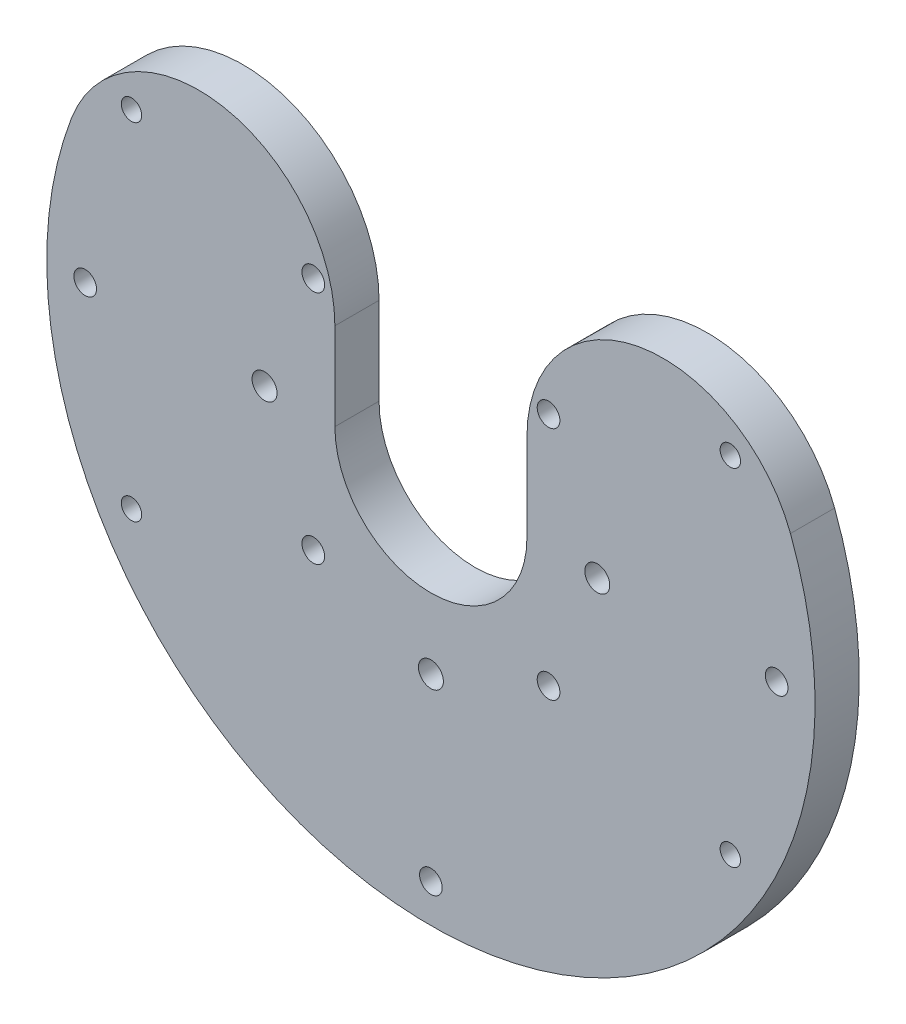
ISO-10303-21;
HEADER;
FILE_DESCRIPTION(('STEP AP214'),'2;1');
FILE_NAME('part.step','',(''),(''),'','','');
FILE_SCHEMA(('AUTOMOTIVE_DESIGN { 1 0 10303 214 1 1 1 1 }'));
ENDSEC;
DATA;
#1=APPLICATION_CONTEXT('core data for automotive mechanical design processes');
#2=APPLICATION_PROTOCOL_DEFINITION('international standard','automotive_design',2000,#1);
#3=PRODUCT_CONTEXT('',#1,'mechanical');
#4=PRODUCT('Part','Part','',(#3));
#5=PRODUCT_RELATED_PRODUCT_CATEGORY('part','',(#4));
#6=PRODUCT_DEFINITION_FORMATION('','',#4);
#7=PRODUCT_DEFINITION_CONTEXT('part definition',#1,'design');
#8=PRODUCT_DEFINITION('design','',#6,#7);
#9=PRODUCT_DEFINITION_SHAPE('','',#8);
#10=(LENGTH_UNIT() NAMED_UNIT(*) SI_UNIT(.MILLI.,.METRE.));
#11=(NAMED_UNIT(*) PLANE_ANGLE_UNIT() SI_UNIT($,.RADIAN.));
#12=(NAMED_UNIT(*) SI_UNIT($,.STERADIAN.) SOLID_ANGLE_UNIT());
#13=UNCERTAINTY_MEASURE_WITH_UNIT(LENGTH_MEASURE(1.E-05),#10,'distance_accuracy_value','');
#14=(GEOMETRIC_REPRESENTATION_CONTEXT(3) GLOBAL_UNCERTAINTY_ASSIGNED_CONTEXT((#13)) GLOBAL_UNIT_ASSIGNED_CONTEXT((#10,
#11,#12)) REPRESENTATION_CONTEXT('',''));
#15=CARTESIAN_POINT('',(0.,0.,0.));
#16=DIRECTION('',(0.,0.,1.));
#17=DIRECTION('',(1.,0.,0.));
#18=AXIS2_PLACEMENT_3D('',#15,#16,#17);
#19=CARTESIAN_POINT('',(0.,0.,5.842));
#20=DIRECTION('',(0.,0.,-1.));
#21=DIRECTION('',(-1.,0.,0.));
#22=AXIS2_PLACEMENT_3D('',#19,#20,#21);
#23=CYLINDRICAL_SURFACE('',#22,12.7);
#24=CARTESIAN_POINT('',(0.,0.,0.));
#25=DIRECTION('',(0.,0.,1.));
#26=DIRECTION('',(1.,0.,0.));
#27=AXIS2_PLACEMENT_3D('',#24,#25,#26);
#28=CIRCLE('',#27,12.7);
#29=CARTESIAN_POINT('',(-12.7,0.,0.));
#30=VERTEX_POINT('',#29);
#31=CARTESIAN_POINT('',(12.7,0.,0.));
#32=VERTEX_POINT('',#31);
#33=EDGE_CURVE('E97',#30,#32,#28,.T.);
#34=ORIENTED_EDGE('',*,*,#33,.F.);
#35=DIRECTION('',(0.,0.,-1.));
#36=VECTOR('',#35,1.);
#37=CARTESIAN_POINT('',(-12.7,0.,5.842));
#38=LINE('',#37,#36);
#39=CARTESIAN_POINT('',(-12.7,0.,5.842));
#40=VERTEX_POINT('',#39);
#41=EDGE_CURVE('E92',#40,#30,#38,.T.);
#42=ORIENTED_EDGE('',*,*,#41,.F.);
#43=CARTESIAN_POINT('',(0.,0.,5.842));
#44=DIRECTION('',(0.,0.,1.));
#45=DIRECTION('',(1.,0.,0.));
#46=AXIS2_PLACEMENT_3D('',#43,#44,#45);
#47=CIRCLE('',#46,12.7);
#48=CARTESIAN_POINT('',(12.7,0.,5.842));
#49=VERTEX_POINT('',#48);
#50=EDGE_CURVE('E94',#40,#49,#47,.T.);
#51=ORIENTED_EDGE('',*,*,#50,.T.);
#52=DIRECTION('',(0.,0.,-1.));
#53=VECTOR('',#52,1.);
#54=CARTESIAN_POINT('',(12.7,0.,5.842));
#55=LINE('',#54,#53);
#56=EDGE_CURVE('E100',#49,#32,#55,.T.);
#57=ORIENTED_EDGE('',*,*,#56,.T.);
#58=EDGE_LOOP('',(#34,#42,#51,#57));
#59=FACE_BOUND('',#58,.T.);
#60=ADVANCED_FACE('F37',(#59),#23,.F.);
#61=CARTESIAN_POINT('',(-12.7,0.,5.842));
#62=DIRECTION('',(-1.,0.,0.));
#63=DIRECTION('',(0.,0.,1.));
#64=AXIS2_PLACEMENT_3D('',#61,#62,#63);
#65=PLANE('',#64);
#66=DIRECTION('',(0.,1.,0.));
#67=VECTOR('',#66,1.);
#68=CARTESIAN_POINT('',(-12.7,0.,0.));
#69=LINE('',#68,#67);
#70=CARTESIAN_POINT('',(-12.7,11.5477270490777,0.));
#71=VERTEX_POINT('',#70);
#72=EDGE_CURVE('E152',#30,#71,#69,.T.);
#73=ORIENTED_EDGE('',*,*,#72,.T.);
#74=DIRECTION('',(0.,0.,-1.));
#75=VECTOR('',#74,1.);
#76=CARTESIAN_POINT('',(-12.7,11.5477270490777,5.842));
#77=LINE('',#76,#75);
#78=CARTESIAN_POINT('',(-12.7,11.5477270490777,5.842));
#79=VERTEX_POINT('',#78);
#80=EDGE_CURVE('E11',#71,#79,#77,.F.);
#81=ORIENTED_EDGE('',*,*,#80,.T.);
#82=DIRECTION('',(0.,1.,0.));
#83=VECTOR('',#82,1.);
#84=CARTESIAN_POINT('',(-12.7,0.,5.842));
#85=LINE('',#84,#83);
#86=EDGE_CURVE('E102',#40,#79,#85,.T.);
#87=ORIENTED_EDGE('',*,*,#86,.F.);
#88=ORIENTED_EDGE('',*,*,#41,.T.);
#89=EDGE_LOOP('',(#73,#81,#87,#88));
#90=FACE_BOUND('',#89,.T.);
#91=ADVANCED_FACE('F103',(#90),#65,.F.);
#92=CARTESIAN_POINT('',(0.,0.,5.842));
#93=DIRECTION('',(0.,0.,-1.));
#94=DIRECTION('',(-1.,0.,0.));
#95=AXIS2_PLACEMENT_3D('',#92,#93,#94);
#96=CYLINDRICAL_SURFACE('',#95,50.8);
#97=CARTESIAN_POINT('',(0.,0.,0.));
#98=DIRECTION('',(0.,0.,1.));
#99=DIRECTION('',(1.,0.,0.));
#100=AXIS2_PLACEMENT_3D('',#97,#98,#99);
#101=CIRCLE('',#100,50.8);
#102=CARTESIAN_POINT('',(-47.5475609756098,17.8848943321081,0.));
#103=VERTEX_POINT('',#102);
#104=CARTESIAN_POINT('',(47.5475609756098,17.8848943321081,0.));
#105=VERTEX_POINT('',#104);
#106=EDGE_CURVE('E154',#103,#105,#101,.T.);
#107=ORIENTED_EDGE('',*,*,#106,.T.);
#108=DIRECTION('',(0.,0.,-1.));
#109=VECTOR('',#108,1.);
#110=CARTESIAN_POINT('',(47.5475609756098,17.8848943321081,5.842));
#111=LINE('',#110,#109);
#112=CARTESIAN_POINT('',(47.5475609756098,17.8848943321081,5.842));
#113=VERTEX_POINT('',#112);
#114=EDGE_CURVE('E58',#105,#113,#111,.F.);
#115=ORIENTED_EDGE('',*,*,#114,.T.);
#116=CARTESIAN_POINT('',(0.,0.,5.842));
#117=DIRECTION('',(0.,0.,1.));
#118=DIRECTION('',(1.,0.,0.));
#119=AXIS2_PLACEMENT_3D('',#116,#117,#118);
#120=CIRCLE('',#119,50.8);
#121=CARTESIAN_POINT('',(-47.5475609756098,17.8848943321081,5.842));
#122=VERTEX_POINT('',#121);
#123=EDGE_CURVE('E106',#122,#113,#120,.T.);
#124=ORIENTED_EDGE('',*,*,#123,.F.);
#125=DIRECTION('',(0.,0.,-1.));
#126=VECTOR('',#125,1.);
#127=CARTESIAN_POINT('',(-47.5475609756098,17.8848943321081,5.842));
#128=LINE('',#127,#126);
#129=EDGE_CURVE('E167',#122,#103,#128,.T.);
#130=ORIENTED_EDGE('',*,*,#129,.T.);
#131=EDGE_LOOP('',(#107,#115,#124,#130));
#132=FACE_BOUND('',#131,.T.);
#133=ADVANCED_FACE('F182',(#132),#96,.T.);
#134=CARTESIAN_POINT('',(22.,0.,5.842));
#135=DIRECTION('',(0.,0.,-1.));
#136=DIRECTION('',(-1.,0.,0.));
#137=AXIS2_PLACEMENT_3D('',#134,#135,#136);
#138=CYLINDRICAL_SURFACE('',#137,1.65);
#139=CARTESIAN_POINT('',(22.,0.,5.842));
#140=DIRECTION('',(0.,0.,1.));
#141=DIRECTION('',(1.,0.,0.));
#142=AXIS2_PLACEMENT_3D('',#139,#140,#141);
#143=CIRCLE('',#142,1.65);
#144=CARTESIAN_POINT('',(23.65,0.,5.842));
#145=VERTEX_POINT('',#144);
#146=EDGE_CURVE('E111',#145,#145,#143,.T.);
#147=ORIENTED_EDGE('',*,*,#146,.T.);
#148=EDGE_LOOP('',(#147));
#149=FACE_BOUND('',#148,.T.);
#150=CARTESIAN_POINT('',(22.,0.,0.));
#151=DIRECTION('',(0.,0.,1.));
#152=DIRECTION('',(1.,0.,0.));
#153=AXIS2_PLACEMENT_3D('',#150,#151,#152);
#154=CIRCLE('',#153,1.65);
#155=CARTESIAN_POINT('',(23.65,0.,0.));
#156=VERTEX_POINT('',#155);
#157=EDGE_CURVE('E148',#156,#156,#154,.T.);
#158=ORIENTED_EDGE('',*,*,#157,.F.);
#159=EDGE_LOOP('',(#158));
#160=FACE_BOUND('',#159,.T.);
#161=ADVANCED_FACE('F202',(#149,#160),#138,.F.);
#162=CARTESIAN_POINT('',(0.,-22.,5.842));
#163=DIRECTION('',(0.,0.,-1.));
#164=DIRECTION('',(-1.,0.,0.));
#165=AXIS2_PLACEMENT_3D('',#162,#163,#164);
#166=CYLINDRICAL_SURFACE('',#165,1.65);
#167=CARTESIAN_POINT('',(0.,-22.,5.842));
#168=DIRECTION('',(0.,0.,1.));
#169=DIRECTION('',(1.,0.,0.));
#170=AXIS2_PLACEMENT_3D('',#167,#168,#169);
#171=CIRCLE('',#170,1.65);
#172=CARTESIAN_POINT('',(1.65,-22.,5.842));
#173=VERTEX_POINT('',#172);
#174=EDGE_CURVE('E114',#173,#173,#171,.T.);
#175=ORIENTED_EDGE('',*,*,#174,.T.);
#176=EDGE_LOOP('',(#175));
#177=FACE_BOUND('',#176,.T.);
#178=CARTESIAN_POINT('',(0.,-22.,0.));
#179=DIRECTION('',(0.,0.,1.));
#180=DIRECTION('',(1.,0.,0.));
#181=AXIS2_PLACEMENT_3D('',#178,#179,#180);
#182=CIRCLE('',#181,1.65);
#183=CARTESIAN_POINT('',(1.65,-22.,0.));
#184=VERTEX_POINT('',#183);
#185=EDGE_CURVE('E145',#184,#184,#182,.T.);
#186=ORIENTED_EDGE('',*,*,#185,.F.);
#187=EDGE_LOOP('',(#186));
#188=FACE_BOUND('',#187,.T.);
#189=ADVANCED_FACE('F205',(#177,#188),#166,.F.);
#190=CARTESIAN_POINT('',(-22.,0.,5.842));
#191=DIRECTION('',(0.,0.,-1.));
#192=DIRECTION('',(-1.,0.,0.));
#193=AXIS2_PLACEMENT_3D('',#190,#191,#192);
#194=CYLINDRICAL_SURFACE('',#193,1.65);
#195=CARTESIAN_POINT('',(-22.,0.,5.842));
#196=DIRECTION('',(0.,0.,1.));
#197=DIRECTION('',(1.,0.,0.));
#198=AXIS2_PLACEMENT_3D('',#195,#196,#197);
#199=CIRCLE('',#198,1.65);
#200=CARTESIAN_POINT('',(-20.35,0.,5.842));
#201=VERTEX_POINT('',#200);
#202=EDGE_CURVE('E465',#201,#201,#199,.T.);
#203=ORIENTED_EDGE('',*,*,#202,.T.);
#204=EDGE_LOOP('',(#203));
#205=FACE_BOUND('',#204,.T.);
#206=CARTESIAN_POINT('',(-22.,0.,0.));
#207=DIRECTION('',(0.,0.,1.));
#208=DIRECTION('',(1.,0.,0.));
#209=AXIS2_PLACEMENT_3D('',#206,#207,#208);
#210=CIRCLE('',#209,1.65);
#211=CARTESIAN_POINT('',(-20.35,0.,0.));
#212=VERTEX_POINT('',#211);
#213=EDGE_CURVE('E142',#212,#212,#210,.T.);
#214=ORIENTED_EDGE('',*,*,#213,.F.);
#215=EDGE_LOOP('',(#214));
#216=FACE_BOUND('',#215,.T.);
#217=ADVANCED_FACE('F209',(#205,#216),#194,.F.);
#218=CARTESIAN_POINT('',(-45.72,0.,5.842));
#219=DIRECTION('',(0.,0.,-1.));
#220=DIRECTION('',(-1.,0.,0.));
#221=AXIS2_PLACEMENT_3D('',#218,#219,#220);
#222=CYLINDRICAL_SURFACE('',#221,1.5);
#223=CARTESIAN_POINT('',(-45.72,0.,5.842));
#224=DIRECTION('',(0.,0.,1.));
#225=DIRECTION('',(1.,0.,0.));
#226=AXIS2_PLACEMENT_3D('',#223,#224,#225);
#227=CIRCLE('',#226,1.5);
#228=CARTESIAN_POINT('',(-44.22,0.,5.842));
#229=VERTEX_POINT('',#228);
#230=EDGE_CURVE('E462',#229,#229,#227,.T.);
#231=ORIENTED_EDGE('',*,*,#230,.T.);
#232=EDGE_LOOP('',(#231));
#233=FACE_BOUND('',#232,.T.);
#234=CARTESIAN_POINT('',(-45.72,0.,0.));
#235=DIRECTION('',(0.,0.,1.));
#236=DIRECTION('',(1.,0.,0.));
#237=AXIS2_PLACEMENT_3D('',#234,#235,#236);
#238=CIRCLE('',#237,1.5);
#239=CARTESIAN_POINT('',(-44.22,0.,0.));
#240=VERTEX_POINT('',#239);
#241=EDGE_CURVE('E139',#240,#240,#238,.T.);
#242=ORIENTED_EDGE('',*,*,#241,.F.);
#243=EDGE_LOOP('',(#242));
#244=FACE_BOUND('',#243,.T.);
#245=ADVANCED_FACE('F213',(#233,#244),#222,.F.);
#246=CARTESIAN_POINT('',(45.72,0.,5.842));
#247=DIRECTION('',(0.,0.,-1.));
#248=DIRECTION('',(-1.,0.,0.));
#249=AXIS2_PLACEMENT_3D('',#246,#247,#248);
#250=CYLINDRICAL_SURFACE('',#249,1.5);
#251=CARTESIAN_POINT('',(45.72,0.,5.842));
#252=DIRECTION('',(0.,0.,1.));
#253=DIRECTION('',(1.,0.,0.));
#254=AXIS2_PLACEMENT_3D('',#251,#252,#253);
#255=CIRCLE('',#254,1.5);
#256=CARTESIAN_POINT('',(47.22,0.,5.842));
#257=VERTEX_POINT('',#256);
#258=EDGE_CURVE('E459',#257,#257,#255,.T.);
#259=ORIENTED_EDGE('',*,*,#258,.T.);
#260=EDGE_LOOP('',(#259));
#261=FACE_BOUND('',#260,.T.);
#262=CARTESIAN_POINT('',(45.72,0.,0.));
#263=DIRECTION('',(0.,0.,1.));
#264=DIRECTION('',(1.,0.,0.));
#265=AXIS2_PLACEMENT_3D('',#262,#263,#264);
#266=CIRCLE('',#265,1.5);
#267=CARTESIAN_POINT('',(47.22,0.,0.));
#268=VERTEX_POINT('',#267);
#269=EDGE_CURVE('E136',#268,#268,#266,.T.);
#270=ORIENTED_EDGE('',*,*,#269,.F.);
#271=EDGE_LOOP('',(#270));
#272=FACE_BOUND('',#271,.T.);
#273=ADVANCED_FACE('F217',(#261,#272),#250,.F.);
#274=CARTESIAN_POINT('',(0.,-45.72,5.842));
#275=DIRECTION('',(0.,0.,-1.));
#276=DIRECTION('',(-1.,0.,0.));
#277=AXIS2_PLACEMENT_3D('',#274,#275,#276);
#278=CYLINDRICAL_SURFACE('',#277,1.5);
#279=CARTESIAN_POINT('',(0.,-45.72,5.842));
#280=DIRECTION('',(0.,0.,1.));
#281=DIRECTION('',(1.,0.,0.));
#282=AXIS2_PLACEMENT_3D('',#279,#280,#281);
#283=CIRCLE('',#282,1.5);
#284=CARTESIAN_POINT('',(1.50000000000001,-45.72,5.842));
#285=VERTEX_POINT('',#284);
#286=EDGE_CURVE('E456',#285,#285,#283,.T.);
#287=ORIENTED_EDGE('',*,*,#286,.T.);
#288=EDGE_LOOP('',(#287));
#289=FACE_BOUND('',#288,.T.);
#290=CARTESIAN_POINT('',(0.,-45.72,0.));
#291=DIRECTION('',(0.,0.,1.));
#292=DIRECTION('',(1.,0.,0.));
#293=AXIS2_PLACEMENT_3D('',#290,#291,#292);
#294=CIRCLE('',#293,1.5);
#295=CARTESIAN_POINT('',(1.50000000000001,-45.72,0.));
#296=VERTEX_POINT('',#295);
#297=EDGE_CURVE('E133',#296,#296,#294,.T.);
#298=ORIENTED_EDGE('',*,*,#297,.F.);
#299=EDGE_LOOP('',(#298));
#300=FACE_BOUND('',#299,.T.);
#301=ADVANCED_FACE('F221',(#289,#300),#278,.F.);
#302=CARTESIAN_POINT('',(39.5946814610245,22.86,5.842));
#303=DIRECTION('',(0.,0.,-1.));
#304=DIRECTION('',(-1.,0.,0.));
#305=AXIS2_PLACEMENT_3D('',#302,#303,#304);
#306=CYLINDRICAL_SURFACE('',#305,1.35);
#307=CARTESIAN_POINT('',(39.5946814610245,22.86,5.842));
#308=DIRECTION('',(0.,0.,1.));
#309=DIRECTION('',(1.,0.,0.));
#310=AXIS2_PLACEMENT_3D('',#307,#308,#309);
#311=CIRCLE('',#310,1.35);
#312=CARTESIAN_POINT('',(40.9446814610245,22.86,5.842));
#313=VERTEX_POINT('',#312);
#314=EDGE_CURVE('E453',#313,#313,#311,.T.);
#315=ORIENTED_EDGE('',*,*,#314,.T.);
#316=EDGE_LOOP('',(#315));
#317=FACE_BOUND('',#316,.T.);
#318=CARTESIAN_POINT('',(39.5946814610245,22.86,0.));
#319=DIRECTION('',(0.,0.,1.));
#320=DIRECTION('',(1.,0.,0.));
#321=AXIS2_PLACEMENT_3D('',#318,#319,#320);
#322=CIRCLE('',#321,1.35);
#323=CARTESIAN_POINT('',(40.9446814610245,22.86,0.));
#324=VERTEX_POINT('',#323);
#325=EDGE_CURVE('E130',#324,#324,#322,.T.);
#326=ORIENTED_EDGE('',*,*,#325,.F.);
#327=EDGE_LOOP('',(#326));
#328=FACE_BOUND('',#327,.T.);
#329=ADVANCED_FACE('F225',(#317,#328),#306,.F.);
#330=CARTESIAN_POINT('',(39.5946814610245,-22.86,5.842));
#331=DIRECTION('',(0.,0.,-1.));
#332=DIRECTION('',(-1.,0.,0.));
#333=AXIS2_PLACEMENT_3D('',#330,#331,#332);
#334=CYLINDRICAL_SURFACE('',#333,1.35);
#335=CARTESIAN_POINT('',(39.5946814610245,-22.86,5.842));
#336=DIRECTION('',(0.,0.,1.));
#337=DIRECTION('',(1.,0.,0.));
#338=AXIS2_PLACEMENT_3D('',#335,#336,#337);
#339=CIRCLE('',#338,1.35);
#340=CARTESIAN_POINT('',(40.9446814610245,-22.86,5.842));
#341=VERTEX_POINT('',#340);
#342=EDGE_CURVE('E450',#341,#341,#339,.T.);
#343=ORIENTED_EDGE('',*,*,#342,.T.);
#344=EDGE_LOOP('',(#343));
#345=FACE_BOUND('',#344,.T.);
#346=CARTESIAN_POINT('',(39.5946814610245,-22.86,0.));
#347=DIRECTION('',(0.,0.,1.));
#348=DIRECTION('',(1.,0.,0.));
#349=AXIS2_PLACEMENT_3D('',#346,#347,#348);
#350=CIRCLE('',#349,1.35);
#351=CARTESIAN_POINT('',(40.9446814610245,-22.86,0.));
#352=VERTEX_POINT('',#351);
#353=EDGE_CURVE('E127',#352,#352,#350,.T.);
#354=ORIENTED_EDGE('',*,*,#353,.F.);
#355=EDGE_LOOP('',(#354));
#356=FACE_BOUND('',#355,.T.);
#357=ADVANCED_FACE('F229',(#345,#356),#334,.F.);
#358=CARTESIAN_POINT('',(-39.5946814610245,-22.86,5.842));
#359=DIRECTION('',(0.,0.,-1.));
#360=DIRECTION('',(-1.,0.,0.));
#361=AXIS2_PLACEMENT_3D('',#358,#359,#360);
#362=CYLINDRICAL_SURFACE('',#361,1.35);
#363=CARTESIAN_POINT('',(-39.5946814610245,-22.86,5.842));
#364=DIRECTION('',(0.,0.,1.));
#365=DIRECTION('',(1.,0.,0.));
#366=AXIS2_PLACEMENT_3D('',#363,#364,#365);
#367=CIRCLE('',#366,1.35);
#368=CARTESIAN_POINT('',(-38.2446814610245,-22.86,5.842));
#369=VERTEX_POINT('',#368);
#370=EDGE_CURVE('E447',#369,#369,#367,.T.);
#371=ORIENTED_EDGE('',*,*,#370,.T.);
#372=EDGE_LOOP('',(#371));
#373=FACE_BOUND('',#372,.T.);
#374=CARTESIAN_POINT('',(-39.5946814610245,-22.86,0.));
#375=DIRECTION('',(0.,0.,1.));
#376=DIRECTION('',(1.,0.,0.));
#377=AXIS2_PLACEMENT_3D('',#374,#375,#376);
#378=CIRCLE('',#377,1.35);
#379=CARTESIAN_POINT('',(-38.2446814610245,-22.86,0.));
#380=VERTEX_POINT('',#379);
#381=EDGE_CURVE('E123',#380,#380,#378,.T.);
#382=ORIENTED_EDGE('',*,*,#381,.F.);
#383=EDGE_LOOP('',(#382));
#384=FACE_BOUND('',#383,.T.);
#385=ADVANCED_FACE('F233',(#373,#384),#362,.F.);
#386=CARTESIAN_POINT('',(-39.5946814610245,22.86,5.842));
#387=DIRECTION('',(0.,0.,-1.));
#388=DIRECTION('',(-1.,0.,0.));
#389=AXIS2_PLACEMENT_3D('',#386,#387,#388);
#390=CYLINDRICAL_SURFACE('',#389,1.35);
#391=CARTESIAN_POINT('',(-39.5946814610245,22.86,5.842));
#392=DIRECTION('',(0.,0.,1.));
#393=DIRECTION('',(1.,0.,0.));
#394=AXIS2_PLACEMENT_3D('',#391,#392,#393);
#395=CIRCLE('',#394,1.35);
#396=CARTESIAN_POINT('',(-38.2446814610246,22.86,5.842));
#397=VERTEX_POINT('',#396);
#398=EDGE_CURVE('E159',#397,#397,#395,.T.);
#399=ORIENTED_EDGE('',*,*,#398,.T.);
#400=EDGE_LOOP('',(#399));
#401=FACE_BOUND('',#400,.T.);
#402=CARTESIAN_POINT('',(-39.5946814610245,22.86,0.));
#403=DIRECTION('',(0.,0.,1.));
#404=DIRECTION('',(1.,0.,0.));
#405=AXIS2_PLACEMENT_3D('',#402,#403,#404);
#406=CIRCLE('',#405,1.35);
#407=CARTESIAN_POINT('',(-38.2446814610246,22.86,0.));
#408=VERTEX_POINT('',#407);
#409=EDGE_CURVE('E120',#408,#408,#406,.T.);
#410=ORIENTED_EDGE('',*,*,#409,.F.);
#411=EDGE_LOOP('',(#410));
#412=FACE_BOUND('',#411,.T.);
#413=ADVANCED_FACE('F237',(#401,#412),#390,.F.);
#414=CARTESIAN_POINT('',(12.7,0.,5.842));
#415=DIRECTION('',(-1.,0.,0.));
#416=DIRECTION('',(0.,0.,1.));
#417=AXIS2_PLACEMENT_3D('',#414,#415,#416);
#418=PLANE('',#417);
#419=DIRECTION('',(0.,1.,0.));
#420=VECTOR('',#419,1.);
#421=CARTESIAN_POINT('',(12.7,0.,5.842));
#422=LINE('',#421,#420);
#423=CARTESIAN_POINT('',(12.7,11.5477270490777,5.842));
#424=VERTEX_POINT('',#423);
#425=EDGE_CURVE('E110',#49,#424,#422,.T.);
#426=ORIENTED_EDGE('',*,*,#425,.T.);
#427=DIRECTION('',(0.,0.,1.));
#428=VECTOR('',#427,1.);
#429=CARTESIAN_POINT('',(12.7,11.5477270490777,0.));
#430=LINE('',#429,#428);
#431=CARTESIAN_POINT('',(12.7,11.5477270490777,0.));
#432=VERTEX_POINT('',#431);
#433=EDGE_CURVE('E99',#424,#432,#430,.F.);
#434=ORIENTED_EDGE('',*,*,#433,.T.);
#435=DIRECTION('',(0.,1.,0.));
#436=VECTOR('',#435,1.);
#437=CARTESIAN_POINT('',(12.7,0.,0.));
#438=LINE('',#437,#436);
#439=EDGE_CURVE('E156',#32,#432,#438,.T.);
#440=ORIENTED_EDGE('',*,*,#439,.F.);
#441=ORIENTED_EDGE('',*,*,#56,.F.);
#442=EDGE_LOOP('',(#426,#434,#440,#441));
#443=FACE_BOUND('',#442,.T.);
#444=ADVANCED_FACE('F176',(#443),#418,.T.);
#445=CARTESIAN_POINT('',(0.,0.,5.842));
#446=DIRECTION('',(0.,0.,1.));
#447=DIRECTION('',(1.,0.,0.));
#448=AXIS2_PLACEMENT_3D('',#445,#446,#447);
#449=PLANE('',#448);
#450=CARTESIAN_POINT('',(15.5563491861041,-15.556349186104,5.842));
#451=DIRECTION('',(0.,0.,1.));
#452=DIRECTION('',(1.,0.,0.));
#453=AXIS2_PLACEMENT_3D('',#450,#451,#452);
#454=CIRCLE('',#453,1.5);
#455=CARTESIAN_POINT('',(17.0563491861041,-15.556349186104,5.842));
#456=VERTEX_POINT('',#455);
#457=EDGE_CURVE('E425',#456,#456,#454,.T.);
#458=ORIENTED_EDGE('',*,*,#457,.F.);
#459=EDGE_LOOP('',(#458));
#460=FACE_BOUND('',#459,.T.);
#461=CARTESIAN_POINT('',(15.556349186104,15.5563491861041,5.842));
#462=DIRECTION('',(0.,0.,1.));
#463=DIRECTION('',(1.,0.,0.));
#464=AXIS2_PLACEMENT_3D('',#461,#462,#463);
#465=CIRCLE('',#464,1.5);
#466=CARTESIAN_POINT('',(17.056349186104,15.5563491861041,5.842));
#467=VERTEX_POINT('',#466);
#468=EDGE_CURVE('E427',#467,#467,#465,.T.);
#469=ORIENTED_EDGE('',*,*,#468,.F.);
#470=EDGE_LOOP('',(#469));
#471=FACE_BOUND('',#470,.T.);
#472=CARTESIAN_POINT('',(-15.5563491861041,15.556349186104,5.842));
#473=DIRECTION('',(0.,0.,1.));
#474=DIRECTION('',(1.,0.,0.));
#475=AXIS2_PLACEMENT_3D('',#472,#473,#474);
#476=CIRCLE('',#475,1.5);
#477=CARTESIAN_POINT('',(-14.0563491861041,15.556349186104,5.842));
#478=VERTEX_POINT('',#477);
#479=EDGE_CURVE('E433',#478,#478,#476,.T.);
#480=ORIENTED_EDGE('',*,*,#479,.F.);
#481=EDGE_LOOP('',(#480));
#482=FACE_BOUND('',#481,.T.);
#483=CARTESIAN_POINT('',(-15.556349186104,-15.5563491861041,5.842));
#484=DIRECTION('',(0.,0.,1.));
#485=DIRECTION('',(1.,0.,0.));
#486=AXIS2_PLACEMENT_3D('',#483,#484,#485);
#487=CIRCLE('',#486,1.5);
#488=CARTESIAN_POINT('',(-14.056349186104,-15.5563491861041,5.842));
#489=VERTEX_POINT('',#488);
#490=EDGE_CURVE('E439',#489,#489,#487,.T.);
#491=ORIENTED_EDGE('',*,*,#490,.F.);
#492=EDGE_LOOP('',(#491));
#493=FACE_BOUND('',#492,.T.);
#494=ORIENTED_EDGE('',*,*,#398,.F.);
#495=EDGE_LOOP('',(#494));
#496=FACE_BOUND('',#495,.T.);
#497=ORIENTED_EDGE('',*,*,#370,.F.);
#498=EDGE_LOOP('',(#497));
#499=FACE_BOUND('',#498,.T.);
#500=ORIENTED_EDGE('',*,*,#342,.F.);
#501=EDGE_LOOP('',(#500));
#502=FACE_BOUND('',#501,.T.);
#503=ORIENTED_EDGE('',*,*,#314,.F.);
#504=EDGE_LOOP('',(#503));
#505=FACE_BOUND('',#504,.T.);
#506=ORIENTED_EDGE('',*,*,#286,.F.);
#507=EDGE_LOOP('',(#506));
#508=FACE_BOUND('',#507,.T.);
#509=ORIENTED_EDGE('',*,*,#258,.F.);
#510=EDGE_LOOP('',(#509));
#511=FACE_BOUND('',#510,.T.);
#512=ORIENTED_EDGE('',*,*,#230,.F.);
#513=EDGE_LOOP('',(#512));
#514=FACE_BOUND('',#513,.T.);
#515=ORIENTED_EDGE('',*,*,#202,.F.);
#516=EDGE_LOOP('',(#515));
#517=FACE_BOUND('',#516,.T.);
#518=ORIENTED_EDGE('',*,*,#174,.F.);
#519=EDGE_LOOP('',(#518));
#520=FACE_BOUND('',#519,.T.);
#521=ORIENTED_EDGE('',*,*,#146,.F.);
#522=EDGE_LOOP('',(#521));
#523=FACE_BOUND('',#522,.T.);
#524=ORIENTED_EDGE('',*,*,#123,.T.);
#525=CARTESIAN_POINT('',(30.7,11.5477270490777,5.842));
#526=DIRECTION('',(0.,0.,1.));
#527=DIRECTION('',(1.,0.,0.));
#528=AXIS2_PLACEMENT_3D('',#525,#526,#527);
#529=CIRCLE('',#528,18.);
#530=EDGE_CURVE('E45',#113,#424,#529,.T.);
#531=ORIENTED_EDGE('',*,*,#530,.T.);
#532=ORIENTED_EDGE('',*,*,#425,.F.);
#533=ORIENTED_EDGE('',*,*,#50,.F.);
#534=ORIENTED_EDGE('',*,*,#86,.T.);
#535=CARTESIAN_POINT('',(-30.7,11.5477270490777,5.842));
#536=DIRECTION('',(0.,0.,1.));
#537=DIRECTION('',(1.,0.,0.));
#538=AXIS2_PLACEMENT_3D('',#535,#536,#537);
#539=CIRCLE('',#538,18.);
#540=EDGE_CURVE('E171',#79,#122,#539,.T.);
#541=ORIENTED_EDGE('',*,*,#540,.T.);
#542=EDGE_LOOP('',(#524,#531,#532,#533,#534,#541));
#543=FACE_BOUND('',#542,.T.);
#544=ADVANCED_FACE('F108',(#460,#471,#482,#493,#496,#499,#502,#505,#508,#511,#514,#517,#520,
#523,#543),#449,.T.);
#545=CARTESIAN_POINT('',(0.,0.,0.));
#546=DIRECTION('',(0.,0.,1.));
#547=DIRECTION('',(1.,0.,0.));
#548=AXIS2_PLACEMENT_3D('',#545,#546,#547);
#549=PLANE('',#548);
#550=CARTESIAN_POINT('',(15.5563491861041,-15.556349186104,0.));
#551=DIRECTION('',(0.,0.,1.));
#552=DIRECTION('',(1.,0.,0.));
#553=AXIS2_PLACEMENT_3D('',#550,#551,#552);
#554=CIRCLE('',#553,1.5);
#555=CARTESIAN_POINT('',(17.0563491861041,-15.556349186104,0.));
#556=VERTEX_POINT('',#555);
#557=EDGE_CURVE('E422',#556,#556,#554,.T.);
#558=ORIENTED_EDGE('',*,*,#557,.T.);
#559=EDGE_LOOP('',(#558));
#560=FACE_BOUND('',#559,.T.);
#561=CARTESIAN_POINT('',(15.556349186104,15.5563491861041,0.));
#562=DIRECTION('',(0.,0.,1.));
#563=DIRECTION('',(1.,0.,0.));
#564=AXIS2_PLACEMENT_3D('',#561,#562,#563);
#565=CIRCLE('',#564,1.5);
#566=CARTESIAN_POINT('',(17.056349186104,15.5563491861041,0.));
#567=VERTEX_POINT('',#566);
#568=EDGE_CURVE('E430',#567,#567,#565,.T.);
#569=ORIENTED_EDGE('',*,*,#568,.T.);
#570=EDGE_LOOP('',(#569));
#571=FACE_BOUND('',#570,.T.);
#572=CARTESIAN_POINT('',(-15.5563491861041,15.556349186104,0.));
#573=DIRECTION('',(0.,0.,1.));
#574=DIRECTION('',(1.,0.,0.));
#575=AXIS2_PLACEMENT_3D('',#572,#573,#574);
#576=CIRCLE('',#575,1.5);
#577=CARTESIAN_POINT('',(-14.0563491861041,15.556349186104,0.));
#578=VERTEX_POINT('',#577);
#579=EDGE_CURVE('E436',#578,#578,#576,.T.);
#580=ORIENTED_EDGE('',*,*,#579,.T.);
#581=EDGE_LOOP('',(#580));
#582=FACE_BOUND('',#581,.T.);
#583=CARTESIAN_POINT('',(-15.556349186104,-15.5563491861041,0.));
#584=DIRECTION('',(0.,0.,1.));
#585=DIRECTION('',(1.,0.,0.));
#586=AXIS2_PLACEMENT_3D('',#583,#584,#585);
#587=CIRCLE('',#586,1.5);
#588=CARTESIAN_POINT('',(-14.056349186104,-15.5563491861041,0.));
#589=VERTEX_POINT('',#588);
#590=EDGE_CURVE('E124',#589,#589,#587,.T.);
#591=ORIENTED_EDGE('',*,*,#590,.T.);
#592=EDGE_LOOP('',(#591));
#593=FACE_BOUND('',#592,.T.);
#594=ORIENTED_EDGE('',*,*,#409,.T.);
#595=EDGE_LOOP('',(#594));
#596=FACE_BOUND('',#595,.T.);
#597=ORIENTED_EDGE('',*,*,#381,.T.);
#598=EDGE_LOOP('',(#597));
#599=FACE_BOUND('',#598,.T.);
#600=ORIENTED_EDGE('',*,*,#353,.T.);
#601=EDGE_LOOP('',(#600));
#602=FACE_BOUND('',#601,.T.);
#603=ORIENTED_EDGE('',*,*,#325,.T.);
#604=EDGE_LOOP('',(#603));
#605=FACE_BOUND('',#604,.T.);
#606=ORIENTED_EDGE('',*,*,#297,.T.);
#607=EDGE_LOOP('',(#606));
#608=FACE_BOUND('',#607,.T.);
#609=ORIENTED_EDGE('',*,*,#269,.T.);
#610=EDGE_LOOP('',(#609));
#611=FACE_BOUND('',#610,.T.);
#612=ORIENTED_EDGE('',*,*,#241,.T.);
#613=EDGE_LOOP('',(#612));
#614=FACE_BOUND('',#613,.T.);
#615=ORIENTED_EDGE('',*,*,#213,.T.);
#616=EDGE_LOOP('',(#615));
#617=FACE_BOUND('',#616,.T.);
#618=ORIENTED_EDGE('',*,*,#185,.T.);
#619=EDGE_LOOP('',(#618));
#620=FACE_BOUND('',#619,.T.);
#621=ORIENTED_EDGE('',*,*,#157,.T.);
#622=EDGE_LOOP('',(#621));
#623=FACE_BOUND('',#622,.T.);
#624=ORIENTED_EDGE('',*,*,#439,.T.);
#625=CARTESIAN_POINT('',(30.7,11.5477270490777,0.));
#626=DIRECTION('',(0.,0.,1.));
#627=DIRECTION('',(1.,0.,0.));
#628=AXIS2_PLACEMENT_3D('',#625,#626,#627);
#629=CIRCLE('',#628,18.);
#630=EDGE_CURVE('E165',#432,#105,#629,.F.);
#631=ORIENTED_EDGE('',*,*,#630,.T.);
#632=ORIENTED_EDGE('',*,*,#106,.F.);
#633=CARTESIAN_POINT('',(-30.7,11.5477270490777,0.));
#634=DIRECTION('',(0.,0.,1.));
#635=DIRECTION('',(1.,0.,0.));
#636=AXIS2_PLACEMENT_3D('',#633,#634,#635);
#637=CIRCLE('',#636,18.);
#638=EDGE_CURVE('E163',#103,#71,#637,.F.);
#639=ORIENTED_EDGE('',*,*,#638,.T.);
#640=ORIENTED_EDGE('',*,*,#72,.F.);
#641=ORIENTED_EDGE('',*,*,#33,.T.);
#642=EDGE_LOOP('',(#624,#631,#632,#639,#640,#641));
#643=FACE_BOUND('',#642,.T.);
#644=ADVANCED_FACE('F181',(#560,#571,#582,#593,#596,#599,#602,#605,#608,#611,#614,#617,#620,
#623,#643),#549,.F.);
#645=CARTESIAN_POINT('',(30.7,11.5477270490777,5.842));
#646=DIRECTION('',(0.,0.,-1.));
#647=DIRECTION('',(-1.,0.,0.));
#648=AXIS2_PLACEMENT_3D('',#645,#646,#647);
#649=CYLINDRICAL_SURFACE('',#648,18.);
#650=ORIENTED_EDGE('',*,*,#530,.F.);
#651=ORIENTED_EDGE('',*,*,#114,.F.);
#652=ORIENTED_EDGE('',*,*,#630,.F.);
#653=ORIENTED_EDGE('',*,*,#433,.F.);
#654=EDGE_LOOP('',(#650,#651,#652,#653));
#655=FACE_BOUND('',#654,.T.);
#656=ADVANCED_FACE('F178',(#655),#649,.T.);
#657=CARTESIAN_POINT('',(-30.7,11.5477270490777,5.842));
#658=DIRECTION('',(0.,0.,-1.));
#659=DIRECTION('',(-1.,0.,0.));
#660=AXIS2_PLACEMENT_3D('',#657,#658,#659);
#661=CYLINDRICAL_SURFACE('',#660,18.);
#662=ORIENTED_EDGE('',*,*,#540,.F.);
#663=ORIENTED_EDGE('',*,*,#80,.F.);
#664=ORIENTED_EDGE('',*,*,#638,.F.);
#665=ORIENTED_EDGE('',*,*,#129,.F.);
#666=EDGE_LOOP('',(#662,#663,#664,#665));
#667=FACE_BOUND('',#666,.T.);
#668=ADVANCED_FACE('F39',(#667),#661,.T.);
#669=CARTESIAN_POINT('',(-15.556349186104,-15.5563491861041,0.));
#670=DIRECTION('',(0.,0.,1.));
#671=DIRECTION('',(1.,0.,0.));
#672=AXIS2_PLACEMENT_3D('',#669,#670,#671);
#673=CYLINDRICAL_SURFACE('',#672,1.5);
#674=ORIENTED_EDGE('',*,*,#590,.F.);
#675=EDGE_LOOP('',(#674));
#676=FACE_BOUND('',#675,.T.);
#677=ORIENTED_EDGE('',*,*,#490,.T.);
#678=EDGE_LOOP('',(#677));
#679=FACE_BOUND('',#678,.T.);
#680=ADVANCED_FACE('F186',(#676,#679),#673,.F.);
#681=CARTESIAN_POINT('',(-15.5563491861041,15.556349186104,0.));
#682=DIRECTION('',(0.,0.,1.));
#683=DIRECTION('',(1.,0.,0.));
#684=AXIS2_PLACEMENT_3D('',#681,#682,#683);
#685=CYLINDRICAL_SURFACE('',#684,1.5);
#686=ORIENTED_EDGE('',*,*,#579,.F.);
#687=EDGE_LOOP('',(#686));
#688=FACE_BOUND('',#687,.T.);
#689=ORIENTED_EDGE('',*,*,#479,.T.);
#690=EDGE_LOOP('',(#689));
#691=FACE_BOUND('',#690,.T.);
#692=ADVANCED_FACE('F191',(#688,#691),#685,.F.);
#693=CARTESIAN_POINT('',(15.556349186104,15.5563491861041,0.));
#694=DIRECTION('',(0.,0.,1.));
#695=DIRECTION('',(1.,0.,0.));
#696=AXIS2_PLACEMENT_3D('',#693,#694,#695);
#697=CYLINDRICAL_SURFACE('',#696,1.5);
#698=ORIENTED_EDGE('',*,*,#568,.F.);
#699=EDGE_LOOP('',(#698));
#700=FACE_BOUND('',#699,.T.);
#701=ORIENTED_EDGE('',*,*,#468,.T.);
#702=EDGE_LOOP('',(#701));
#703=FACE_BOUND('',#702,.T.);
#704=ADVANCED_FACE('F396',(#700,#703),#697,.F.);
#705=CARTESIAN_POINT('',(15.5563491861041,-15.556349186104,0.));
#706=DIRECTION('',(0.,0.,1.));
#707=DIRECTION('',(1.,0.,0.));
#708=AXIS2_PLACEMENT_3D('',#705,#706,#707);
#709=CYLINDRICAL_SURFACE('',#708,1.5);
#710=ORIENTED_EDGE('',*,*,#557,.F.);
#711=EDGE_LOOP('',(#710));
#712=FACE_BOUND('',#711,.T.);
#713=ORIENTED_EDGE('',*,*,#457,.T.);
#714=EDGE_LOOP('',(#713));
#715=FACE_BOUND('',#714,.T.);
#716=ADVANCED_FACE('F405',(#712,#715),#709,.F.);
#717=CLOSED_SHELL('',(#60,#91,#133,#161,#189,#217,#245,#273,#301,#329,#357,#385,#413,#444,#544,
#644,#656,#668,#680,#692,#704,#716));
#718=MANIFOLD_SOLID_BREP('B2',#717);
#719=ADVANCED_BREP_SHAPE_REPRESENTATION('',(#18,#718),#14);
#720=SHAPE_DEFINITION_REPRESENTATION(#9,#719);
ENDSEC;
END-ISO-10303-21;
